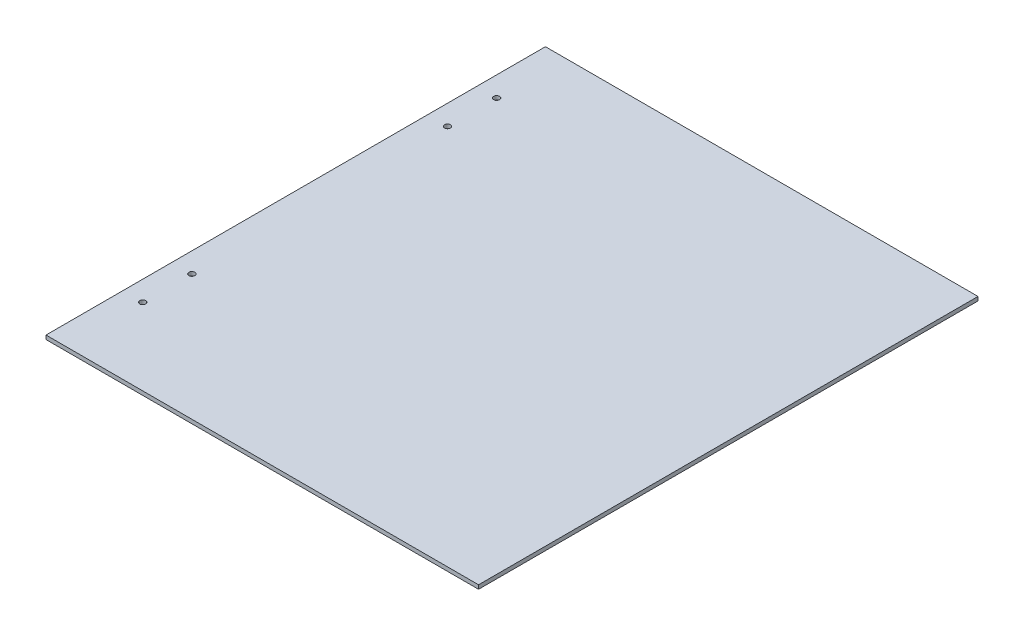
ISO-10303-21;
HEADER;
FILE_DESCRIPTION(('STEP AP214'),'2;1');
FILE_NAME('part.step','',(''),(''),'','','');
FILE_SCHEMA(('AUTOMOTIVE_DESIGN { 1 0 10303 214 1 1 1 1 }'));
ENDSEC;
DATA;
#1=APPLICATION_CONTEXT('core data for automotive mechanical design processes');
#2=APPLICATION_PROTOCOL_DEFINITION('international standard','automotive_design',2000,#1);
#3=PRODUCT_CONTEXT('',#1,'mechanical');
#4=PRODUCT('Part','Part','',(#3));
#5=PRODUCT_RELATED_PRODUCT_CATEGORY('part','',(#4));
#6=PRODUCT_DEFINITION_FORMATION('','',#4);
#7=PRODUCT_DEFINITION_CONTEXT('part definition',#1,'design');
#8=PRODUCT_DEFINITION('design','',#6,#7);
#9=PRODUCT_DEFINITION_SHAPE('','',#8);
#10=(LENGTH_UNIT() NAMED_UNIT(*) SI_UNIT(.MILLI.,.METRE.));
#11=(NAMED_UNIT(*) PLANE_ANGLE_UNIT() SI_UNIT($,.RADIAN.));
#12=(NAMED_UNIT(*) SI_UNIT($,.STERADIAN.) SOLID_ANGLE_UNIT());
#13=UNCERTAINTY_MEASURE_WITH_UNIT(LENGTH_MEASURE(1.E-05),#10,'distance_accuracy_value','');
#14=(GEOMETRIC_REPRESENTATION_CONTEXT(3) GLOBAL_UNCERTAINTY_ASSIGNED_CONTEXT((#13)) GLOBAL_UNIT_ASSIGNED_CONTEXT((#10,
#11,#12)) REPRESENTATION_CONTEXT('',''));
#15=CARTESIAN_POINT('',(0.,0.,0.));
#16=DIRECTION('',(0.,0.,1.));
#17=DIRECTION('',(1.,0.,0.));
#18=AXIS2_PLACEMENT_3D('',#15,#16,#17);
#19=CARTESIAN_POINT('',(-124.757070340827,-2.,183.485134155185));
#20=DIRECTION('',(0.,0.,1.));
#21=DIRECTION('',(1.,0.,0.));
#22=AXIS2_PLACEMENT_3D('',#19,#20,#21);
#23=PLANE('',#22);
#24=DIRECTION('',(1.,0.,0.));
#25=VECTOR('',#24,1.);
#26=CARTESIAN_POINT('',(-124.757070340827,0.,183.485134155185));
#27=LINE('',#26,#25);
#28=CARTESIAN_POINT('',(-124.757070340827,0.,183.485134155185));
#29=VERTEX_POINT('',#28);
#30=CARTESIAN_POINT('',(95.2429296591733,0.,183.485134155185));
#31=VERTEX_POINT('',#30);
#32=EDGE_CURVE('E104',#29,#31,#27,.T.);
#33=ORIENTED_EDGE('',*,*,#32,.F.);
#34=DIRECTION('',(0.,1.,0.));
#35=VECTOR('',#34,1.);
#36=CARTESIAN_POINT('',(-124.757070340827,-2.,183.485134155185));
#37=LINE('',#36,#35);
#38=CARTESIAN_POINT('',(-124.757070340827,-2.,183.485134155185));
#39=VERTEX_POINT('',#38);
#40=EDGE_CURVE('E11',#39,#29,#37,.T.);
#41=ORIENTED_EDGE('',*,*,#40,.F.);
#42=DIRECTION('',(1.,0.,0.));
#43=VECTOR('',#42,1.);
#44=CARTESIAN_POINT('',(-124.757070340827,-2.,183.485134155185));
#45=LINE('',#44,#43);
#46=CARTESIAN_POINT('',(95.2429296591733,-2.,183.485134155185));
#47=VERTEX_POINT('',#46);
#48=EDGE_CURVE('E97',#39,#47,#45,.T.);
#49=ORIENTED_EDGE('',*,*,#48,.T.);
#50=DIRECTION('',(0.,1.,0.));
#51=VECTOR('',#50,1.);
#52=CARTESIAN_POINT('',(95.2429296591733,-2.,183.485134155185));
#53=LINE('',#52,#51);
#54=EDGE_CURVE('E42',#47,#31,#53,.T.);
#55=ORIENTED_EDGE('',*,*,#54,.T.);
#56=EDGE_LOOP('',(#33,#41,#49,#55));
#57=FACE_BOUND('',#56,.T.);
#58=ADVANCED_FACE('F39',(#57),#23,.T.);
#59=CARTESIAN_POINT('',(-124.757070340827,-2.,-70.5148658448151));
#60=DIRECTION('',(-1.,0.,0.));
#61=DIRECTION('',(0.,0.,1.));
#62=AXIS2_PLACEMENT_3D('',#59,#60,#61);
#63=PLANE('',#62);
#64=DIRECTION('',(0.,0.,1.));
#65=VECTOR('',#64,1.);
#66=CARTESIAN_POINT('',(-124.757070340827,0.,-70.5148658448151));
#67=LINE('',#66,#65);
#68=CARTESIAN_POINT('',(-124.757070340827,0.,-70.5148658448151));
#69=VERTEX_POINT('',#68);
#70=EDGE_CURVE('E99',#69,#29,#67,.T.);
#71=ORIENTED_EDGE('',*,*,#70,.F.);
#72=DIRECTION('',(0.,1.,0.));
#73=VECTOR('',#72,1.);
#74=CARTESIAN_POINT('',(-124.757070340827,-2.,-70.5148658448151));
#75=LINE('',#74,#73);
#76=CARTESIAN_POINT('',(-124.757070340827,-2.,-70.5148658448151));
#77=VERTEX_POINT('',#76);
#78=EDGE_CURVE('E48',#77,#69,#75,.T.);
#79=ORIENTED_EDGE('',*,*,#78,.F.);
#80=DIRECTION('',(0.,0.,1.));
#81=VECTOR('',#80,1.);
#82=CARTESIAN_POINT('',(-124.757070340827,-2.,-70.5148658448151));
#83=LINE('',#82,#81);
#84=EDGE_CURVE('E87',#77,#39,#83,.T.);
#85=ORIENTED_EDGE('',*,*,#84,.T.);
#86=ORIENTED_EDGE('',*,*,#40,.T.);
#87=EDGE_LOOP('',(#71,#79,#85,#86));
#88=FACE_BOUND('',#87,.T.);
#89=ADVANCED_FACE('F115',(#88),#63,.T.);
#90=CARTESIAN_POINT('',(-124.757070340827,-2.,-70.5148658448151));
#91=DIRECTION('',(0.,0.,1.));
#92=DIRECTION('',(1.,0.,0.));
#93=AXIS2_PLACEMENT_3D('',#90,#91,#92);
#94=PLANE('',#93);
#95=DIRECTION('',(1.,0.,0.));
#96=VECTOR('',#95,1.);
#97=CARTESIAN_POINT('',(-124.757070340827,0.,-70.5148658448151));
#98=LINE('',#97,#96);
#99=CARTESIAN_POINT('',(95.2429296591733,0.,-70.5148658448151));
#100=VERTEX_POINT('',#99);
#101=EDGE_CURVE('E92',#69,#100,#98,.T.);
#102=ORIENTED_EDGE('',*,*,#101,.T.);
#103=DIRECTION('',(0.,1.,0.));
#104=VECTOR('',#103,1.);
#105=CARTESIAN_POINT('',(95.2429296591733,-2.,-70.5148658448151));
#106=LINE('',#105,#104);
#107=CARTESIAN_POINT('',(95.2429296591733,-2.,-70.5148658448151));
#108=VERTEX_POINT('',#107);
#109=EDGE_CURVE('E90',#108,#100,#106,.T.);
#110=ORIENTED_EDGE('',*,*,#109,.F.);
#111=DIRECTION('',(1.,0.,0.));
#112=VECTOR('',#111,1.);
#113=CARTESIAN_POINT('',(-124.757070340827,-2.,-70.5148658448151));
#114=LINE('',#113,#112);
#115=EDGE_CURVE('E84',#77,#108,#114,.T.);
#116=ORIENTED_EDGE('',*,*,#115,.F.);
#117=ORIENTED_EDGE('',*,*,#78,.T.);
#118=EDGE_LOOP('',(#102,#110,#116,#117));
#119=FACE_BOUND('',#118,.T.);
#120=ADVANCED_FACE('F91',(#119),#94,.F.);
#121=CARTESIAN_POINT('',(95.2429296591733,-2.,-70.5148658448151));
#122=DIRECTION('',(-1.,0.,0.));
#123=DIRECTION('',(0.,0.,1.));
#124=AXIS2_PLACEMENT_3D('',#121,#122,#123);
#125=PLANE('',#124);
#126=DIRECTION('',(0.,0.,1.));
#127=VECTOR('',#126,1.);
#128=CARTESIAN_POINT('',(95.2429296591733,0.,-70.5148658448151));
#129=LINE('',#128,#127);
#130=EDGE_CURVE('E107',#100,#31,#129,.T.);
#131=ORIENTED_EDGE('',*,*,#130,.T.);
#132=ORIENTED_EDGE('',*,*,#54,.F.);
#133=DIRECTION('',(0.,0.,1.));
#134=VECTOR('',#133,1.);
#135=CARTESIAN_POINT('',(95.2429296591733,-2.,-70.5148658448151));
#136=LINE('',#135,#134);
#137=EDGE_CURVE('E81',#108,#47,#136,.T.);
#138=ORIENTED_EDGE('',*,*,#137,.F.);
#139=ORIENTED_EDGE('',*,*,#109,.T.);
#140=EDGE_LOOP('',(#131,#132,#138,#139));
#141=FACE_BOUND('',#140,.T.);
#142=ADVANCED_FACE('F96',(#141),#125,.F.);
#143=CARTESIAN_POINT('',(0.,-2.,0.));
#144=DIRECTION('',(0.,-1.,0.));
#145=DIRECTION('',(0.,0.,-1.));
#146=AXIS2_PLACEMENT_3D('',#143,#144,#145);
#147=PLANE('',#146);
#148=CARTESIAN_POINT('',(-114.564799313,-2.,-35.5148658448151));
#149=DIRECTION('',(0.,1.,0.));
#150=DIRECTION('',(0.,0.,1.));
#151=AXIS2_PLACEMENT_3D('',#148,#149,#150);
#152=CIRCLE('',#151,1.5);
#153=CARTESIAN_POINT('',(-114.564799313,-2.,-34.0148658448151));
#154=VERTEX_POINT('',#153);
#155=EDGE_CURVE('E156',#154,#154,#152,.T.);
#156=ORIENTED_EDGE('',*,*,#155,.T.);
#157=EDGE_LOOP('',(#156));
#158=FACE_BOUND('',#157,.T.);
#159=CARTESIAN_POINT('',(-114.564799313,-2.,-10.5148658448151));
#160=DIRECTION('',(0.,1.,0.));
#161=DIRECTION('',(0.,0.,1.));
#162=AXIS2_PLACEMENT_3D('',#159,#160,#161);
#163=CIRCLE('',#162,1.5);
#164=CARTESIAN_POINT('',(-114.564799313,-2.,-9.01486584481508));
#165=VERTEX_POINT('',#164);
#166=EDGE_CURVE('E160',#165,#165,#163,.T.);
#167=ORIENTED_EDGE('',*,*,#166,.T.);
#168=EDGE_LOOP('',(#167));
#169=FACE_BOUND('',#168,.T.);
#170=CARTESIAN_POINT('',(-114.564799313,-2.,119.485134155185));
#171=DIRECTION('',(0.,1.,0.));
#172=DIRECTION('',(0.,0.,1.));
#173=AXIS2_PLACEMENT_3D('',#170,#171,#172);
#174=CIRCLE('',#173,1.5);
#175=CARTESIAN_POINT('',(-114.564799313,-2.,120.985134155185));
#176=VERTEX_POINT('',#175);
#177=EDGE_CURVE('E169',#176,#176,#174,.T.);
#178=ORIENTED_EDGE('',*,*,#177,.T.);
#179=EDGE_LOOP('',(#178));
#180=FACE_BOUND('',#179,.T.);
#181=CARTESIAN_POINT('',(-114.564799313,-2.,144.485134155185));
#182=DIRECTION('',(0.,1.,0.));
#183=DIRECTION('',(0.,0.,1.));
#184=AXIS2_PLACEMENT_3D('',#181,#182,#183);
#185=CIRCLE('',#184,1.5);
#186=CARTESIAN_POINT('',(-114.564799313,-2.,145.985134155185));
#187=VERTEX_POINT('',#186);
#188=EDGE_CURVE('E175',#187,#187,#185,.T.);
#189=ORIENTED_EDGE('',*,*,#188,.T.);
#190=EDGE_LOOP('',(#189));
#191=FACE_BOUND('',#190,.T.);
#192=ORIENTED_EDGE('',*,*,#48,.F.);
#193=ORIENTED_EDGE('',*,*,#84,.F.);
#194=ORIENTED_EDGE('',*,*,#115,.T.);
#195=ORIENTED_EDGE('',*,*,#137,.T.);
#196=EDGE_LOOP('',(#192,#193,#194,#195));
#197=FACE_BOUND('',#196,.T.);
#198=ADVANCED_FACE('F86',(#158,#169,#180,#191,#197),#147,.T.);
#199=CARTESIAN_POINT('',(0.,0.,0.));
#200=DIRECTION('',(0.,-1.,0.));
#201=DIRECTION('',(0.,0.,-1.));
#202=AXIS2_PLACEMENT_3D('',#199,#200,#201);
#203=PLANE('',#202);
#204=CARTESIAN_POINT('',(-114.564799313,0.,-35.5148658448151));
#205=DIRECTION('',(0.,1.,0.));
#206=DIRECTION('',(0.,0.,1.));
#207=AXIS2_PLACEMENT_3D('',#204,#205,#206);
#208=CIRCLE('',#207,1.5);
#209=CARTESIAN_POINT('',(-114.564799313,0.,-34.0148658448151));
#210=VERTEX_POINT('',#209);
#211=EDGE_CURVE('E159',#210,#210,#208,.T.);
#212=ORIENTED_EDGE('',*,*,#211,.F.);
#213=EDGE_LOOP('',(#212));
#214=FACE_BOUND('',#213,.T.);
#215=CARTESIAN_POINT('',(-114.564799313,0.,-10.5148658448151));
#216=DIRECTION('',(0.,1.,0.));
#217=DIRECTION('',(0.,0.,1.));
#218=AXIS2_PLACEMENT_3D('',#215,#216,#217);
#219=CIRCLE('',#218,1.5);
#220=CARTESIAN_POINT('',(-114.564799313,0.,-9.01486584481508));
#221=VERTEX_POINT('',#220);
#222=EDGE_CURVE('E163',#221,#221,#219,.T.);
#223=ORIENTED_EDGE('',*,*,#222,.F.);
#224=EDGE_LOOP('',(#223));
#225=FACE_BOUND('',#224,.T.);
#226=CARTESIAN_POINT('',(-114.564799313,0.,119.485134155185));
#227=DIRECTION('',(0.,1.,0.));
#228=DIRECTION('',(0.,0.,1.));
#229=AXIS2_PLACEMENT_3D('',#226,#227,#228);
#230=CIRCLE('',#229,1.5);
#231=CARTESIAN_POINT('',(-114.564799313,0.,120.985134155185));
#232=VERTEX_POINT('',#231);
#233=EDGE_CURVE('E172',#232,#232,#230,.T.);
#234=ORIENTED_EDGE('',*,*,#233,.F.);
#235=EDGE_LOOP('',(#234));
#236=FACE_BOUND('',#235,.T.);
#237=CARTESIAN_POINT('',(-114.564799313,0.,144.485134155185));
#238=DIRECTION('',(0.,1.,0.));
#239=DIRECTION('',(0.,0.,1.));
#240=AXIS2_PLACEMENT_3D('',#237,#238,#239);
#241=CIRCLE('',#240,1.5);
#242=CARTESIAN_POINT('',(-114.564799313,0.,145.985134155185));
#243=VERTEX_POINT('',#242);
#244=EDGE_CURVE('E108',#243,#243,#241,.T.);
#245=ORIENTED_EDGE('',*,*,#244,.F.);
#246=EDGE_LOOP('',(#245));
#247=FACE_BOUND('',#246,.T.);
#248=ORIENTED_EDGE('',*,*,#32,.T.);
#249=ORIENTED_EDGE('',*,*,#130,.F.);
#250=ORIENTED_EDGE('',*,*,#101,.F.);
#251=ORIENTED_EDGE('',*,*,#70,.T.);
#252=EDGE_LOOP('',(#248,#249,#250,#251));
#253=FACE_BOUND('',#252,.T.);
#254=ADVANCED_FACE('F114',(#214,#225,#236,#247,#253),#203,.F.);
#255=CARTESIAN_POINT('',(-114.564799313,0.,144.485134155185));
#256=DIRECTION('',(0.,1.,0.));
#257=DIRECTION('',(0.,0.,1.));
#258=AXIS2_PLACEMENT_3D('',#255,#256,#257);
#259=CYLINDRICAL_SURFACE('',#258,1.5);
#260=ORIENTED_EDGE('',*,*,#188,.F.);
#261=EDGE_LOOP('',(#260));
#262=FACE_BOUND('',#261,.T.);
#263=ORIENTED_EDGE('',*,*,#244,.T.);
#264=EDGE_LOOP('',(#263));
#265=FACE_BOUND('',#264,.T.);
#266=ADVANCED_FACE('F133',(#262,#265),#259,.F.);
#267=CARTESIAN_POINT('',(-114.564799313,0.,119.485134155185));
#268=DIRECTION('',(0.,1.,0.));
#269=DIRECTION('',(0.,0.,1.));
#270=AXIS2_PLACEMENT_3D('',#267,#268,#269);
#271=CYLINDRICAL_SURFACE('',#270,1.5);
#272=ORIENTED_EDGE('',*,*,#177,.F.);
#273=EDGE_LOOP('',(#272));
#274=FACE_BOUND('',#273,.T.);
#275=ORIENTED_EDGE('',*,*,#233,.T.);
#276=EDGE_LOOP('',(#275));
#277=FACE_BOUND('',#276,.T.);
#278=ADVANCED_FACE('F140',(#274,#277),#271,.F.);
#279=CARTESIAN_POINT('',(-114.564799313,0.,-10.5148658448151));
#280=DIRECTION('',(0.,1.,0.));
#281=DIRECTION('',(0.,0.,1.));
#282=AXIS2_PLACEMENT_3D('',#279,#280,#281);
#283=CYLINDRICAL_SURFACE('',#282,1.5);
#284=ORIENTED_EDGE('',*,*,#166,.F.);
#285=EDGE_LOOP('',(#284));
#286=FACE_BOUND('',#285,.T.);
#287=ORIENTED_EDGE('',*,*,#222,.T.);
#288=EDGE_LOOP('',(#287));
#289=FACE_BOUND('',#288,.T.);
#290=ADVANCED_FACE('F144',(#286,#289),#283,.F.);
#291=CARTESIAN_POINT('',(-114.564799313,0.,-35.5148658448151));
#292=DIRECTION('',(0.,1.,0.));
#293=DIRECTION('',(0.,0.,1.));
#294=AXIS2_PLACEMENT_3D('',#291,#292,#293);
#295=CYLINDRICAL_SURFACE('',#294,1.5);
#296=ORIENTED_EDGE('',*,*,#155,.F.);
#297=EDGE_LOOP('',(#296));
#298=FACE_BOUND('',#297,.T.);
#299=ORIENTED_EDGE('',*,*,#211,.T.);
#300=EDGE_LOOP('',(#299));
#301=FACE_BOUND('',#300,.T.);
#302=ADVANCED_FACE('F148',(#298,#301),#295,.F.);
#303=CLOSED_SHELL('',(#58,#89,#120,#142,#198,#254,#266,#278,#290,#302));
#304=MANIFOLD_SOLID_BREP('B2',#303);
#305=ADVANCED_BREP_SHAPE_REPRESENTATION('',(#18,#304),#14);
#306=SHAPE_DEFINITION_REPRESENTATION(#9,#305);
ENDSEC;
END-ISO-10303-21;
